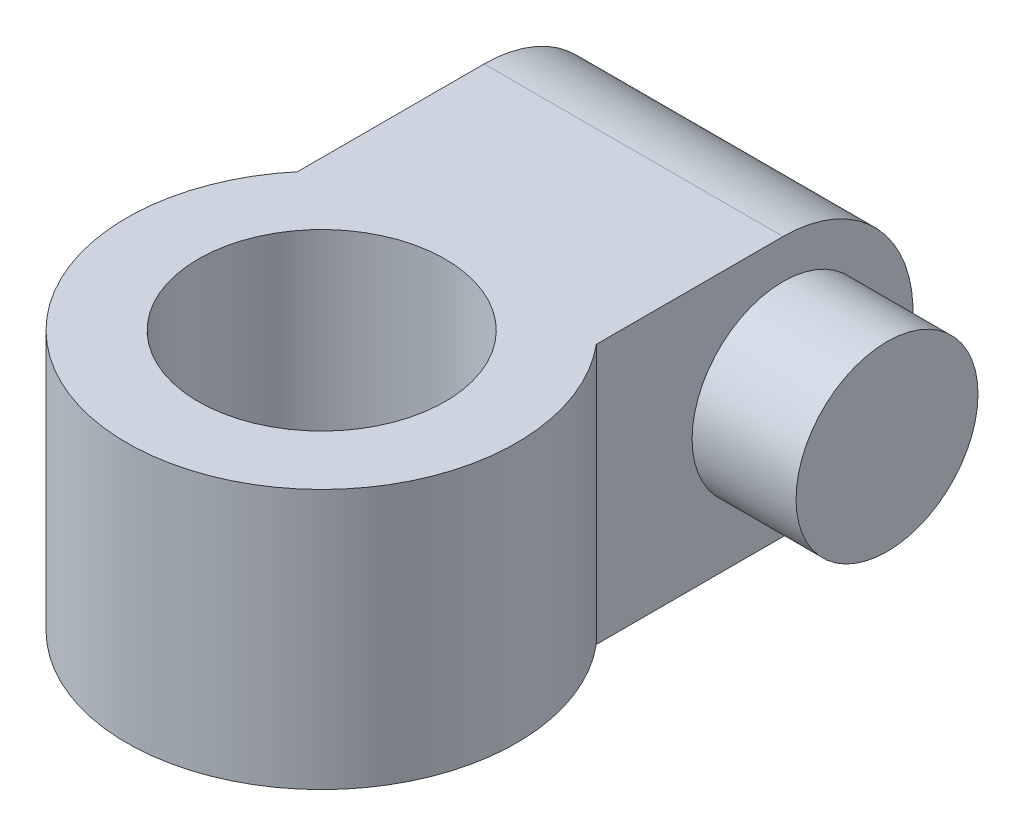
ISO-10303-21;
HEADER;
FILE_DESCRIPTION(('STEP AP214'),'2;1');
FILE_NAME('part.step','',(''),(''),'','','');
FILE_SCHEMA(('AUTOMOTIVE_DESIGN { 1 0 10303 214 1 1 1 1 }'));
ENDSEC;
DATA;
#1=APPLICATION_CONTEXT('core data for automotive mechanical design processes');
#2=APPLICATION_PROTOCOL_DEFINITION('international standard','automotive_design',2000,#1);
#3=PRODUCT_CONTEXT('',#1,'mechanical');
#4=PRODUCT('Part','Part','',(#3));
#5=PRODUCT_RELATED_PRODUCT_CATEGORY('part','',(#4));
#6=PRODUCT_DEFINITION_FORMATION('','',#4);
#7=PRODUCT_DEFINITION_CONTEXT('part definition',#1,'design');
#8=PRODUCT_DEFINITION('design','',#6,#7);
#9=PRODUCT_DEFINITION_SHAPE('','',#8);
#10=(LENGTH_UNIT() NAMED_UNIT(*) SI_UNIT(.MILLI.,.METRE.));
#11=(NAMED_UNIT(*) PLANE_ANGLE_UNIT() SI_UNIT($,.RADIAN.));
#12=(NAMED_UNIT(*) SI_UNIT($,.STERADIAN.) SOLID_ANGLE_UNIT());
#13=UNCERTAINTY_MEASURE_WITH_UNIT(LENGTH_MEASURE(1.E-05),#10,'distance_accuracy_value','');
#14=(GEOMETRIC_REPRESENTATION_CONTEXT(3) GLOBAL_UNCERTAINTY_ASSIGNED_CONTEXT((#13)) GLOBAL_UNIT_ASSIGNED_CONTEXT((#10,
#11,#12)) REPRESENTATION_CONTEXT('',''));
#15=CARTESIAN_POINT('',(0.,0.,0.));
#16=DIRECTION('',(0.,0.,1.));
#17=DIRECTION('',(1.,0.,0.));
#18=AXIS2_PLACEMENT_3D('',#15,#16,#17);
#19=CARTESIAN_POINT('',(0.,-5.,0.));
#20=DIRECTION('',(0.,1.,0.));
#21=DIRECTION('',(1.,0.,0.));
#22=AXIS2_PLACEMENT_3D('',#19,#20,#21);
#23=PLANE('',#22);
#24=DIRECTION('',(1.,0.,0.));
#25=VECTOR('',#24,1.);
#26=CARTESIAN_POINT('',(-5.75,-5.,-12.));
#27=LINE('',#26,#25);
#28=CARTESIAN_POINT('',(-5.75,-5.,-12.));
#29=VERTEX_POINT('',#28);
#30=CARTESIAN_POINT('',(5.75,-5.,-12.));
#31=VERTEX_POINT('',#30);
#32=EDGE_CURVE('E11',#29,#31,#27,.T.);
#33=ORIENTED_EDGE('',*,*,#32,.T.);
#34=DIRECTION('',(0.,0.,-1.));
#35=VECTOR('',#34,1.);
#36=CARTESIAN_POINT('',(5.75,-5.,-4.815340071065));
#37=LINE('',#36,#35);
#38=CARTESIAN_POINT('',(5.75,-5.,-4.815340071065));
#39=VERTEX_POINT('',#38);
#40=EDGE_CURVE('E36',#39,#31,#37,.T.);
#41=ORIENTED_EDGE('',*,*,#40,.F.);
#42=CARTESIAN_POINT('',(0.,-5.,0.));
#43=DIRECTION('',(0.,-1.,0.));
#44=DIRECTION('',(0.766666666666684,0.,-0.642045342808587));
#45=AXIS2_PLACEMENT_3D('',#42,#43,#44);
#46=CIRCLE('',#45,7.5);
#47=CARTESIAN_POINT('',(-5.75,-5.,-4.815340071065));
#48=VERTEX_POINT('',#47);
#49=EDGE_CURVE('E27',#39,#48,#46,.T.);
#50=ORIENTED_EDGE('',*,*,#49,.T.);
#51=DIRECTION('',(0.,0.,1.));
#52=VECTOR('',#51,1.);
#53=CARTESIAN_POINT('',(-5.75,-5.,-12.));
#54=LINE('',#53,#52);
#55=EDGE_CURVE('E97',#29,#48,#54,.T.);
#56=ORIENTED_EDGE('',*,*,#55,.F.);
#57=EDGE_LOOP('',(#33,#41,#50,#56));
#58=FACE_BOUND('',#57,.T.);
#59=CARTESIAN_POINT('',(0.,-5.,0.));
#60=DIRECTION('',(0.,-1.,0.));
#61=DIRECTION('',(-1.,0.,0.));
#62=AXIS2_PLACEMENT_3D('',#59,#60,#61);
#63=CIRCLE('',#62,4.75);
#64=CARTESIAN_POINT('',(-4.75,-5.,0.));
#65=VERTEX_POINT('',#64);
#66=EDGE_CURVE('E85',#65,#65,#63,.T.);
#67=ORIENTED_EDGE('',*,*,#66,.F.);
#68=EDGE_LOOP('',(#67));
#69=FACE_BOUND('',#68,.T.);
#70=ADVANCED_FACE('F17',(#58,#69),#23,.F.);
#71=CARTESIAN_POINT('',(-5.75,0.,0.));
#72=DIRECTION('',(1.,0.,0.));
#73=DIRECTION('',(0.,0.,-1.));
#74=AXIS2_PLACEMENT_3D('',#71,#72,#73);
#75=PLANE('',#74);
#76=DIRECTION('',(0.,0.,-1.));
#77=VECTOR('',#76,1.);
#78=CARTESIAN_POINT('',(-5.75,5.,-4.815340071065));
#79=LINE('',#78,#77);
#80=CARTESIAN_POINT('',(-5.75,5.,-4.815340071065));
#81=VERTEX_POINT('',#80);
#82=CARTESIAN_POINT('',(-5.75,5.,-12.));
#83=VERTEX_POINT('',#82);
#84=EDGE_CURVE('E99',#81,#83,#79,.T.);
#85=ORIENTED_EDGE('',*,*,#84,.T.);
#86=CARTESIAN_POINT('',(-5.75,0.,-12.));
#87=DIRECTION('',(1.,0.,0.));
#88=DIRECTION('',(0.,-1.,0.));
#89=AXIS2_PLACEMENT_3D('',#86,#87,#88);
#90=CIRCLE('',#89,5.);
#91=EDGE_CURVE('E72',#29,#83,#90,.T.);
#92=ORIENTED_EDGE('',*,*,#91,.F.);
#93=ORIENTED_EDGE('',*,*,#55,.T.);
#94=DIRECTION('',(0.,1.,0.));
#95=VECTOR('',#94,1.);
#96=CARTESIAN_POINT('',(-5.75,-5.,-4.815340071065));
#97=LINE('',#96,#95);
#98=EDGE_CURVE('E102',#48,#81,#97,.T.);
#99=ORIENTED_EDGE('',*,*,#98,.T.);
#100=EDGE_LOOP('',(#85,#92,#93,#99));
#101=FACE_BOUND('',#100,.T.);
#102=CARTESIAN_POINT('',(-5.75,0.,-12.));
#103=DIRECTION('',(-1.,0.,0.));
#104=DIRECTION('',(0.,0.,-1.));
#105=AXIS2_PLACEMENT_3D('',#102,#103,#104);
#106=CIRCLE('',#105,2.);
#107=CARTESIAN_POINT('',(-5.75,0.,-14.));
#108=VERTEX_POINT('',#107);
#109=EDGE_CURVE('E89',#108,#108,#106,.T.);
#110=ORIENTED_EDGE('',*,*,#109,.F.);
#111=EDGE_LOOP('',(#110));
#112=FACE_BOUND('',#111,.T.);
#113=ADVANCED_FACE('F123',(#101,#112),#75,.F.);
#114=CARTESIAN_POINT('',(0.,-5.,0.));
#115=DIRECTION('',(0.,1.,0.));
#116=DIRECTION('',(1.,0.,0.));
#117=AXIS2_PLACEMENT_3D('',#114,#115,#116);
#118=CYLINDRICAL_SURFACE('',#117,7.5);
#119=DIRECTION('',(0.,1.,0.));
#120=VECTOR('',#119,1.);
#121=CARTESIAN_POINT('',(5.75,-5.,-4.815340071065));
#122=LINE('',#121,#120);
#123=CARTESIAN_POINT('',(5.75,5.,-4.815340071065));
#124=VERTEX_POINT('',#123);
#125=EDGE_CURVE('E103',#39,#124,#122,.T.);
#126=ORIENTED_EDGE('',*,*,#125,.T.);
#127=CARTESIAN_POINT('',(0.,5.,0.));
#128=DIRECTION('',(0.,1.,0.));
#129=DIRECTION('',(-0.766666666666684,0.,-0.642045342808587));
#130=AXIS2_PLACEMENT_3D('',#127,#128,#129);
#131=CIRCLE('',#130,7.5);
#132=EDGE_CURVE('E55',#81,#124,#131,.T.);
#133=ORIENTED_EDGE('',*,*,#132,.F.);
#134=ORIENTED_EDGE('',*,*,#98,.F.);
#135=ORIENTED_EDGE('',*,*,#49,.F.);
#136=EDGE_LOOP('',(#126,#133,#134,#135));
#137=FACE_BOUND('',#136,.T.);
#138=ADVANCED_FACE('F129',(#137),#118,.T.);
#139=CARTESIAN_POINT('',(0.,5.,0.));
#140=DIRECTION('',(0.,1.,0.));
#141=DIRECTION('',(1.,0.,0.));
#142=AXIS2_PLACEMENT_3D('',#139,#140,#141);
#143=PLANE('',#142);
#144=DIRECTION('',(0.,0.,1.));
#145=VECTOR('',#144,1.);
#146=CARTESIAN_POINT('',(5.75,5.,-12.));
#147=LINE('',#146,#145);
#148=CARTESIAN_POINT('',(5.75,5.,-12.));
#149=VERTEX_POINT('',#148);
#150=EDGE_CURVE('E59',#149,#124,#147,.T.);
#151=ORIENTED_EDGE('',*,*,#150,.F.);
#152=DIRECTION('',(1.,0.,0.));
#153=VECTOR('',#152,1.);
#154=CARTESIAN_POINT('',(-5.75,5.,-12.));
#155=LINE('',#154,#153);
#156=EDGE_CURVE('E63',#83,#149,#155,.T.);
#157=ORIENTED_EDGE('',*,*,#156,.F.);
#158=ORIENTED_EDGE('',*,*,#84,.F.);
#159=ORIENTED_EDGE('',*,*,#132,.T.);
#160=EDGE_LOOP('',(#151,#157,#158,#159));
#161=FACE_BOUND('',#160,.T.);
#162=CARTESIAN_POINT('',(0.,5.,0.));
#163=DIRECTION('',(0.,-1.,0.));
#164=DIRECTION('',(-1.,0.,0.));
#165=AXIS2_PLACEMENT_3D('',#162,#163,#164);
#166=CIRCLE('',#165,4.75);
#167=CARTESIAN_POINT('',(-4.75,5.,0.));
#168=VERTEX_POINT('',#167);
#169=EDGE_CURVE('E74',#168,#168,#166,.T.);
#170=ORIENTED_EDGE('',*,*,#169,.T.);
#171=EDGE_LOOP('',(#170));
#172=FACE_BOUND('',#171,.T.);
#173=ADVANCED_FACE('F61',(#161,#172),#143,.T.);
#174=CARTESIAN_POINT('',(-5.75,0.,-12.));
#175=DIRECTION('',(1.,0.,0.));
#176=DIRECTION('',(0.,0.,-1.));
#177=AXIS2_PLACEMENT_3D('',#174,#175,#176);
#178=CYLINDRICAL_SURFACE('',#177,5.);
#179=ORIENTED_EDGE('',*,*,#156,.T.);
#180=CARTESIAN_POINT('',(5.75,0.,-12.));
#181=DIRECTION('',(1.,0.,0.));
#182=DIRECTION('',(0.,-1.,0.));
#183=AXIS2_PLACEMENT_3D('',#180,#181,#182);
#184=CIRCLE('',#183,5.);
#185=EDGE_CURVE('E64',#31,#149,#184,.T.);
#186=ORIENTED_EDGE('',*,*,#185,.F.);
#187=ORIENTED_EDGE('',*,*,#32,.F.);
#188=ORIENTED_EDGE('',*,*,#91,.T.);
#189=EDGE_LOOP('',(#179,#186,#187,#188));
#190=FACE_BOUND('',#189,.T.);
#191=ADVANCED_FACE('F69',(#190),#178,.T.);
#192=CARTESIAN_POINT('',(5.75,0.,0.));
#193=DIRECTION('',(1.,0.,0.));
#194=DIRECTION('',(0.,0.,-1.));
#195=AXIS2_PLACEMENT_3D('',#192,#193,#194);
#196=PLANE('',#195);
#197=ORIENTED_EDGE('',*,*,#40,.T.);
#198=ORIENTED_EDGE('',*,*,#185,.T.);
#199=ORIENTED_EDGE('',*,*,#150,.T.);
#200=ORIENTED_EDGE('',*,*,#125,.F.);
#201=EDGE_LOOP('',(#197,#198,#199,#200));
#202=FACE_BOUND('',#201,.T.);
#203=CARTESIAN_POINT('',(5.75,0.,-12.));
#204=DIRECTION('',(1.,0.,0.));
#205=DIRECTION('',(0.,0.,1.));
#206=AXIS2_PLACEMENT_3D('',#203,#204,#205);
#207=CIRCLE('',#206,3.5);
#208=CARTESIAN_POINT('',(5.75,0.,-8.5));
#209=VERTEX_POINT('',#208);
#210=EDGE_CURVE('E65',#209,#209,#207,.T.);
#211=ORIENTED_EDGE('',*,*,#210,.F.);
#212=EDGE_LOOP('',(#211));
#213=FACE_BOUND('',#212,.T.);
#214=ADVANCED_FACE('F76',(#202,#213),#196,.T.);
#215=CARTESIAN_POINT('',(5.75,0.,-12.));
#216=DIRECTION('',(1.,0.,0.));
#217=DIRECTION('',(0.,0.,-1.));
#218=AXIS2_PLACEMENT_3D('',#215,#216,#217);
#219=CYLINDRICAL_SURFACE('',#218,3.5);
#220=CARTESIAN_POINT('',(9.75,0.,-12.));
#221=DIRECTION('',(1.,0.,0.));
#222=DIRECTION('',(0.,0.,-1.));
#223=AXIS2_PLACEMENT_3D('',#220,#221,#222);
#224=CIRCLE('',#223,3.5);
#225=CARTESIAN_POINT('',(9.75,0.,-15.5));
#226=VERTEX_POINT('',#225);
#227=EDGE_CURVE('E83',#226,#226,#224,.T.);
#228=ORIENTED_EDGE('',*,*,#227,.F.);
#229=EDGE_LOOP('',(#228));
#230=FACE_BOUND('',#229,.T.);
#231=ORIENTED_EDGE('',*,*,#210,.T.);
#232=EDGE_LOOP('',(#231));
#233=FACE_BOUND('',#232,.T.);
#234=ADVANCED_FACE('F120',(#230,#233),#219,.T.);
#235=CARTESIAN_POINT('',(9.75,0.,0.));
#236=DIRECTION('',(1.,0.,0.));
#237=DIRECTION('',(0.,0.,-1.));
#238=AXIS2_PLACEMENT_3D('',#235,#236,#237);
#239=PLANE('',#238);
#240=ORIENTED_EDGE('',*,*,#227,.T.);
#241=EDGE_LOOP('',(#240));
#242=FACE_BOUND('',#241,.T.);
#243=ADVANCED_FACE('F112',(#242),#239,.T.);
#244=CARTESIAN_POINT('',(0.,5.,0.));
#245=DIRECTION('',(0.,-1.,0.));
#246=DIRECTION('',(1.,0.,0.));
#247=AXIS2_PLACEMENT_3D('',#244,#245,#246);
#248=CYLINDRICAL_SURFACE('',#247,4.75);
#249=ORIENTED_EDGE('',*,*,#66,.T.);
#250=EDGE_LOOP('',(#249));
#251=FACE_BOUND('',#250,.T.);
#252=ORIENTED_EDGE('',*,*,#169,.F.);
#253=EDGE_LOOP('',(#252));
#254=FACE_BOUND('',#253,.T.);
#255=ADVANCED_FACE('F109',(#251,#254),#248,.F.);
#256=CARTESIAN_POINT('',(-5.75,0.,-12.));
#257=DIRECTION('',(-1.,0.,0.));
#258=DIRECTION('',(0.,0.,1.));
#259=AXIS2_PLACEMENT_3D('',#256,#257,#258);
#260=CYLINDRICAL_SURFACE('',#259,2.);
#261=CARTESIAN_POINT('',(-8.75,0.,-12.));
#262=DIRECTION('',(-1.,0.,0.));
#263=DIRECTION('',(0.,0.,1.));
#264=AXIS2_PLACEMENT_3D('',#261,#262,#263);
#265=CIRCLE('',#264,2.);
#266=CARTESIAN_POINT('',(-8.75,0.,-10.));
#267=VERTEX_POINT('',#266);
#268=EDGE_CURVE('E21',#267,#267,#265,.T.);
#269=ORIENTED_EDGE('',*,*,#268,.F.);
#270=EDGE_LOOP('',(#269));
#271=FACE_BOUND('',#270,.T.);
#272=ORIENTED_EDGE('',*,*,#109,.T.);
#273=EDGE_LOOP('',(#272));
#274=FACE_BOUND('',#273,.T.);
#275=ADVANCED_FACE('F111',(#271,#274),#260,.T.);
#276=CARTESIAN_POINT('',(-8.75,0.,0.));
#277=DIRECTION('',(-1.,0.,0.));
#278=DIRECTION('',(0.,0.,1.));
#279=AXIS2_PLACEMENT_3D('',#276,#277,#278);
#280=PLANE('',#279);
#281=ORIENTED_EDGE('',*,*,#268,.T.);
#282=EDGE_LOOP('',(#281));
#283=FACE_BOUND('',#282,.T.);
#284=ADVANCED_FACE('F19',(#283),#280,.T.);
#285=CLOSED_SHELL('',(#70,#113,#138,#173,#191,#214,#234,#243,#255,#275,#284));
#286=MANIFOLD_SOLID_BREP('B1',#285);
#287=ADVANCED_BREP_SHAPE_REPRESENTATION('',(#18,#286),#14);
#288=SHAPE_DEFINITION_REPRESENTATION(#9,#287);
ENDSEC;
END-ISO-10303-21;
